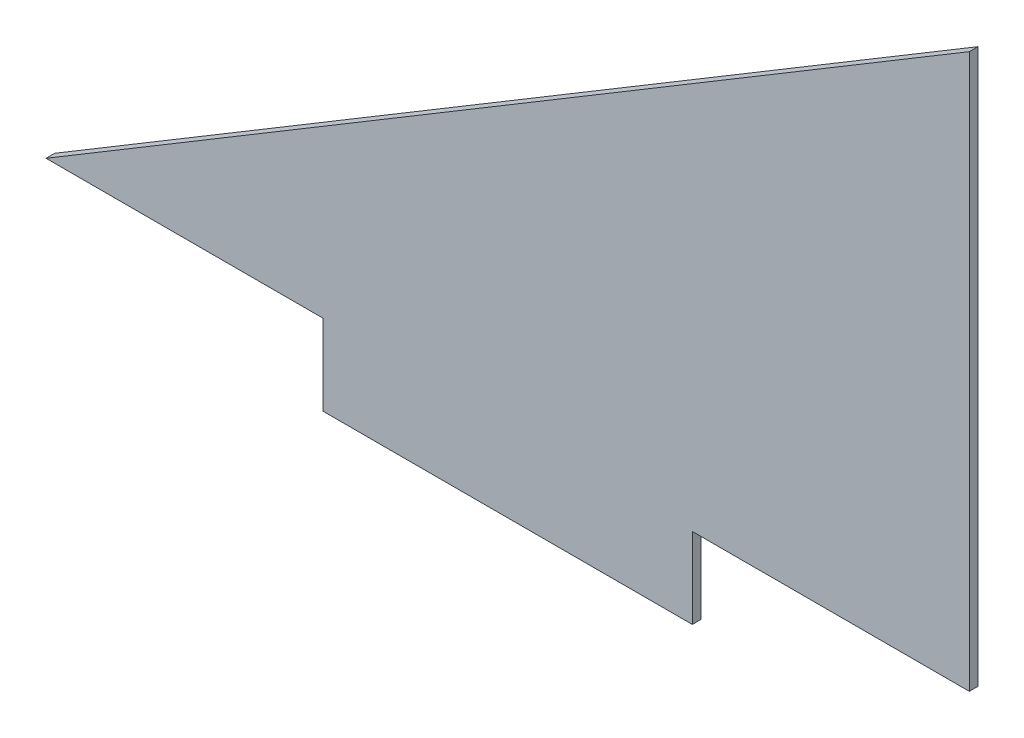
ISO-10303-21;
HEADER;
FILE_DESCRIPTION(('STEP AP214'),'2;1');
FILE_NAME('part.step','',(''),(''),'','','');
FILE_SCHEMA(('AUTOMOTIVE_DESIGN { 1 0 10303 214 1 1 1 1 }'));
ENDSEC;
DATA;
#1=APPLICATION_CONTEXT('core data for automotive mechanical design processes');
#2=APPLICATION_PROTOCOL_DEFINITION('international standard','automotive_design',2000,#1);
#3=PRODUCT_CONTEXT('',#1,'mechanical');
#4=PRODUCT('Part','Part','',(#3));
#5=PRODUCT_RELATED_PRODUCT_CATEGORY('part','',(#4));
#6=PRODUCT_DEFINITION_FORMATION('','',#4);
#7=PRODUCT_DEFINITION_CONTEXT('part definition',#1,'design');
#8=PRODUCT_DEFINITION('design','',#6,#7);
#9=PRODUCT_DEFINITION_SHAPE('','',#8);
#10=(LENGTH_UNIT() NAMED_UNIT(*) SI_UNIT(.MILLI.,.METRE.));
#11=(NAMED_UNIT(*) PLANE_ANGLE_UNIT() SI_UNIT($,.RADIAN.));
#12=(NAMED_UNIT(*) SI_UNIT($,.STERADIAN.) SOLID_ANGLE_UNIT());
#13=UNCERTAINTY_MEASURE_WITH_UNIT(LENGTH_MEASURE(1.E-05),#10,'distance_accuracy_value','');
#14=(GEOMETRIC_REPRESENTATION_CONTEXT(3) GLOBAL_UNCERTAINTY_ASSIGNED_CONTEXT((#13)) GLOBAL_UNIT_ASSIGNED_CONTEXT((#10,
#11,#12)) REPRESENTATION_CONTEXT('',''));
#15=CARTESIAN_POINT('',(0.,0.,0.));
#16=DIRECTION('',(0.,0.,1.));
#17=DIRECTION('',(1.,0.,0.));
#18=AXIS2_PLACEMENT_3D('',#15,#16,#17);
#19=CARTESIAN_POINT('',(0.,152.4,2.3876));
#20=DIRECTION('',(-1.,0.,0.));
#21=DIRECTION('',(0.,-1.,0.));
#22=AXIS2_PLACEMENT_3D('',#19,#20,#21);
#23=PLANE('',#22);
#24=DIRECTION('',(0.,1.,0.));
#25=VECTOR('',#24,1.);
#26=CARTESIAN_POINT('',(0.,152.4,0.));
#27=LINE('',#26,#25);
#28=CARTESIAN_POINT('',(0.,0.,0.));
#29=VERTEX_POINT('',#28);
#30=CARTESIAN_POINT('',(0.,152.4,0.));
#31=VERTEX_POINT('',#30);
#32=EDGE_CURVE('E131',#29,#31,#27,.T.);
#33=ORIENTED_EDGE('',*,*,#32,.T.);
#34=DIRECTION('',(0.,0.,-1.));
#35=VECTOR('',#34,1.);
#36=CARTESIAN_POINT('',(0.,152.4,2.3876));
#37=LINE('',#36,#35);
#38=CARTESIAN_POINT('',(0.,152.4,2.3876));
#39=VERTEX_POINT('',#38);
#40=EDGE_CURVE('E11',#39,#31,#37,.T.);
#41=ORIENTED_EDGE('',*,*,#40,.F.);
#42=DIRECTION('',(0.,1.,0.));
#43=VECTOR('',#42,1.);
#44=CARTESIAN_POINT('',(0.,152.4,2.3876));
#45=LINE('',#44,#43);
#46=CARTESIAN_POINT('',(0.,0.,2.3876));
#47=VERTEX_POINT('',#46);
#48=EDGE_CURVE('E143',#47,#39,#45,.T.);
#49=ORIENTED_EDGE('',*,*,#48,.F.);
#50=DIRECTION('',(0.,0.,-1.));
#51=VECTOR('',#50,1.);
#52=CARTESIAN_POINT('',(0.,0.,2.3876));
#53=LINE('',#52,#51);
#54=EDGE_CURVE('E127',#47,#29,#53,.T.);
#55=ORIENTED_EDGE('',*,*,#54,.T.);
#56=EDGE_LOOP('',(#33,#41,#49,#55));
#57=FACE_BOUND('',#56,.T.);
#58=ADVANCED_FACE('F41',(#57),#23,.F.);
#59=CARTESIAN_POINT('',(-254.,0.,2.3876));
#60=DIRECTION('',(0.514495755427527,-0.857492925712544,0.));
#61=DIRECTION('',(0.857492925712544,0.514495755427527,0.));
#62=AXIS2_PLACEMENT_3D('',#59,#60,#61);
#63=PLANE('',#62);
#64=DIRECTION('',(-0.857492925712544,-0.514495755427527,0.));
#65=VECTOR('',#64,1.);
#66=CARTESIAN_POINT('',(-254.,0.,0.));
#67=LINE('',#66,#65);
#68=CARTESIAN_POINT('',(-254.,0.,0.));
#69=VERTEX_POINT('',#68);
#70=EDGE_CURVE('E134',#31,#69,#67,.T.);
#71=ORIENTED_EDGE('',*,*,#70,.T.);
#72=DIRECTION('',(0.,0.,-1.));
#73=VECTOR('',#72,1.);
#74=CARTESIAN_POINT('',(-254.,0.,2.3876));
#75=LINE('',#74,#73);
#76=CARTESIAN_POINT('',(-254.,0.,2.3876));
#77=VERTEX_POINT('',#76);
#78=EDGE_CURVE('E49',#77,#69,#75,.T.);
#79=ORIENTED_EDGE('',*,*,#78,.F.);
#80=DIRECTION('',(-0.857492925712544,-0.514495755427527,0.));
#81=VECTOR('',#80,1.);
#82=CARTESIAN_POINT('',(-254.,0.,2.3876));
#83=LINE('',#82,#81);
#84=EDGE_CURVE('E97',#39,#77,#83,.T.);
#85=ORIENTED_EDGE('',*,*,#84,.F.);
#86=ORIENTED_EDGE('',*,*,#40,.T.);
#87=EDGE_LOOP('',(#71,#79,#85,#86));
#88=FACE_BOUND('',#87,.T.);
#89=ADVANCED_FACE('F168',(#88),#63,.F.);
#90=CARTESIAN_POINT('',(-177.8,0.,2.3876));
#91=DIRECTION('',(0.,1.,0.));
#92=DIRECTION('',(-1.,0.,0.));
#93=AXIS2_PLACEMENT_3D('',#90,#91,#92);
#94=PLANE('',#93);
#95=DIRECTION('',(1.,0.,0.));
#96=VECTOR('',#95,1.);
#97=CARTESIAN_POINT('',(-177.8,0.,0.));
#98=LINE('',#97,#96);
#99=CARTESIAN_POINT('',(-177.8,0.,0.));
#100=VERTEX_POINT('',#99);
#101=EDGE_CURVE('E136',#69,#100,#98,.T.);
#102=ORIENTED_EDGE('',*,*,#101,.T.);
#103=DIRECTION('',(0.,0.,-1.));
#104=VECTOR('',#103,1.);
#105=CARTESIAN_POINT('',(-177.8,0.,2.3876));
#106=LINE('',#105,#104);
#107=CARTESIAN_POINT('',(-177.8,0.,2.3876));
#108=VERTEX_POINT('',#107);
#109=EDGE_CURVE('E147',#108,#100,#106,.T.);
#110=ORIENTED_EDGE('',*,*,#109,.F.);
#111=DIRECTION('',(1.,0.,0.));
#112=VECTOR('',#111,1.);
#113=CARTESIAN_POINT('',(-177.8,0.,2.3876));
#114=LINE('',#113,#112);
#115=EDGE_CURVE('E155',#77,#108,#114,.T.);
#116=ORIENTED_EDGE('',*,*,#115,.F.);
#117=ORIENTED_EDGE('',*,*,#78,.T.);
#118=EDGE_LOOP('',(#102,#110,#116,#117));
#119=FACE_BOUND('',#118,.T.);
#120=ADVANCED_FACE('F153',(#119),#94,.F.);
#121=CARTESIAN_POINT('',(-177.8,0.,2.3876));
#122=DIRECTION('',(1.,0.,0.));
#123=DIRECTION('',(0.,0.,-1.));
#124=AXIS2_PLACEMENT_3D('',#121,#122,#123);
#125=PLANE('',#124);
#126=DIRECTION('',(0.,-1.,0.));
#127=VECTOR('',#126,1.);
#128=CARTESIAN_POINT('',(-177.8,0.,0.));
#129=LINE('',#128,#127);
#130=CARTESIAN_POINT('',(-177.8,-22.1615,0.));
#131=VERTEX_POINT('',#130);
#132=EDGE_CURVE('E138',#100,#131,#129,.T.);
#133=ORIENTED_EDGE('',*,*,#132,.T.);
#134=DIRECTION('',(0.,0.,-1.));
#135=VECTOR('',#134,1.);
#136=CARTESIAN_POINT('',(-177.8,-22.1615,2.3876));
#137=LINE('',#136,#135);
#138=CARTESIAN_POINT('',(-177.8,-22.1615,2.3876));
#139=VERTEX_POINT('',#138);
#140=EDGE_CURVE('E122',#139,#131,#137,.T.);
#141=ORIENTED_EDGE('',*,*,#140,.F.);
#142=DIRECTION('',(0.,-1.,0.));
#143=VECTOR('',#142,1.);
#144=CARTESIAN_POINT('',(-177.8,0.,2.3876));
#145=LINE('',#144,#143);
#146=EDGE_CURVE('E113',#108,#139,#145,.T.);
#147=ORIENTED_EDGE('',*,*,#146,.F.);
#148=ORIENTED_EDGE('',*,*,#109,.T.);
#149=EDGE_LOOP('',(#133,#141,#147,#148));
#150=FACE_BOUND('',#149,.T.);
#151=ADVANCED_FACE('F161',(#150),#125,.F.);
#152=CARTESIAN_POINT('',(-177.8,-22.1615,2.3876));
#153=DIRECTION('',(0.,1.,0.));
#154=DIRECTION('',(0.,0.,1.));
#155=AXIS2_PLACEMENT_3D('',#152,#153,#154);
#156=PLANE('',#155);
#157=DIRECTION('',(1.,0.,0.));
#158=VECTOR('',#157,1.);
#159=CARTESIAN_POINT('',(-177.8,-22.1615,0.));
#160=LINE('',#159,#158);
#161=CARTESIAN_POINT('',(-76.2,-22.1615,0.));
#162=VERTEX_POINT('',#161);
#163=EDGE_CURVE('E121',#131,#162,#160,.T.);
#164=ORIENTED_EDGE('',*,*,#163,.T.);
#165=DIRECTION('',(0.,0.,-1.));
#166=VECTOR('',#165,1.);
#167=CARTESIAN_POINT('',(-76.2,-22.1615,2.3876));
#168=LINE('',#167,#166);
#169=CARTESIAN_POINT('',(-76.2,-22.1615,2.3876));
#170=VERTEX_POINT('',#169);
#171=EDGE_CURVE('E118',#170,#162,#168,.T.);
#172=ORIENTED_EDGE('',*,*,#171,.F.);
#173=DIRECTION('',(1.,0.,0.));
#174=VECTOR('',#173,1.);
#175=CARTESIAN_POINT('',(-177.8,-22.1615,2.3876));
#176=LINE('',#175,#174);
#177=EDGE_CURVE('E107',#139,#170,#176,.T.);
#178=ORIENTED_EDGE('',*,*,#177,.F.);
#179=ORIENTED_EDGE('',*,*,#140,.T.);
#180=EDGE_LOOP('',(#164,#172,#178,#179));
#181=FACE_BOUND('',#180,.T.);
#182=ADVANCED_FACE('F119',(#181),#156,.F.);
#183=CARTESIAN_POINT('',(-76.2,0.,2.3876));
#184=DIRECTION('',(-1.,0.,0.));
#185=DIRECTION('',(0.,0.,1.));
#186=AXIS2_PLACEMENT_3D('',#183,#184,#185);
#187=PLANE('',#186);
#188=DIRECTION('',(0.,1.,0.));
#189=VECTOR('',#188,1.);
#190=CARTESIAN_POINT('',(-76.2,0.,0.));
#191=LINE('',#190,#189);
#192=CARTESIAN_POINT('',(-76.2,0.,0.));
#193=VERTEX_POINT('',#192);
#194=EDGE_CURVE('E83',#162,#193,#191,.T.);
#195=ORIENTED_EDGE('',*,*,#194,.T.);
#196=DIRECTION('',(0.,0.,-1.));
#197=VECTOR('',#196,1.);
#198=CARTESIAN_POINT('',(-76.2,0.,2.3876));
#199=LINE('',#198,#197);
#200=CARTESIAN_POINT('',(-76.2,0.,2.3876));
#201=VERTEX_POINT('',#200);
#202=EDGE_CURVE('E123',#201,#193,#199,.T.);
#203=ORIENTED_EDGE('',*,*,#202,.F.);
#204=DIRECTION('',(0.,1.,0.));
#205=VECTOR('',#204,1.);
#206=CARTESIAN_POINT('',(-76.2,0.,2.3876));
#207=LINE('',#206,#205);
#208=EDGE_CURVE('E111',#170,#201,#207,.T.);
#209=ORIENTED_EDGE('',*,*,#208,.F.);
#210=ORIENTED_EDGE('',*,*,#171,.T.);
#211=EDGE_LOOP('',(#195,#203,#209,#210));
#212=FACE_BOUND('',#211,.T.);
#213=ADVANCED_FACE('F125',(#212),#187,.F.);
#214=CARTESIAN_POINT('',(0.,0.,2.3876));
#215=DIRECTION('',(0.,1.,0.));
#216=DIRECTION('',(-1.,0.,0.));
#217=AXIS2_PLACEMENT_3D('',#214,#215,#216);
#218=PLANE('',#217);
#219=DIRECTION('',(1.,0.,0.));
#220=VECTOR('',#219,1.);
#221=CARTESIAN_POINT('',(0.,0.,0.));
#222=LINE('',#221,#220);
#223=EDGE_CURVE('E89',#193,#29,#222,.T.);
#224=ORIENTED_EDGE('',*,*,#223,.T.);
#225=ORIENTED_EDGE('',*,*,#54,.F.);
#226=DIRECTION('',(1.,0.,0.));
#227=VECTOR('',#226,1.);
#228=CARTESIAN_POINT('',(0.,0.,2.3876));
#229=LINE('',#228,#227);
#230=EDGE_CURVE('E57',#201,#47,#229,.T.);
#231=ORIENTED_EDGE('',*,*,#230,.F.);
#232=ORIENTED_EDGE('',*,*,#202,.T.);
#233=EDGE_LOOP('',(#224,#225,#231,#232));
#234=FACE_BOUND('',#233,.T.);
#235=ADVANCED_FACE('F182',(#234),#218,.F.);
#236=CARTESIAN_POINT('',(0.,0.,2.3876));
#237=DIRECTION('',(0.,0.,-1.));
#238=DIRECTION('',(-1.,0.,0.));
#239=AXIS2_PLACEMENT_3D('',#236,#237,#238);
#240=PLANE('',#239);
#241=ORIENTED_EDGE('',*,*,#48,.T.);
#242=ORIENTED_EDGE('',*,*,#84,.T.);
#243=ORIENTED_EDGE('',*,*,#115,.T.);
#244=ORIENTED_EDGE('',*,*,#146,.T.);
#245=ORIENTED_EDGE('',*,*,#177,.T.);
#246=ORIENTED_EDGE('',*,*,#208,.T.);
#247=ORIENTED_EDGE('',*,*,#230,.T.);
#248=EDGE_LOOP('',(#241,#242,#243,#244,#245,#246,#247));
#249=FACE_BOUND('',#248,.T.);
#250=ADVANCED_FACE('F109',(#249),#240,.F.);
#251=CARTESIAN_POINT('',(0.,0.,0.));
#252=DIRECTION('',(0.,0.,-1.));
#253=DIRECTION('',(-1.,0.,0.));
#254=AXIS2_PLACEMENT_3D('',#251,#252,#253);
#255=PLANE('',#254);
#256=ORIENTED_EDGE('',*,*,#32,.F.);
#257=ORIENTED_EDGE('',*,*,#223,.F.);
#258=ORIENTED_EDGE('',*,*,#194,.F.);
#259=ORIENTED_EDGE('',*,*,#163,.F.);
#260=ORIENTED_EDGE('',*,*,#132,.F.);
#261=ORIENTED_EDGE('',*,*,#101,.F.);
#262=ORIENTED_EDGE('',*,*,#70,.F.);
#263=EDGE_LOOP('',(#256,#257,#258,#259,#260,#261,#262));
#264=FACE_BOUND('',#263,.T.);
#265=ADVANCED_FACE('F159',(#264),#255,.T.);
#266=CLOSED_SHELL('',(#58,#89,#120,#151,#182,#213,#235,#250,#265));
#267=MANIFOLD_SOLID_BREP('B2',#266);
#268=ADVANCED_BREP_SHAPE_REPRESENTATION('',(#18,#267),#14);
#269=SHAPE_DEFINITION_REPRESENTATION(#9,#268);
ENDSEC;
END-ISO-10303-21;
